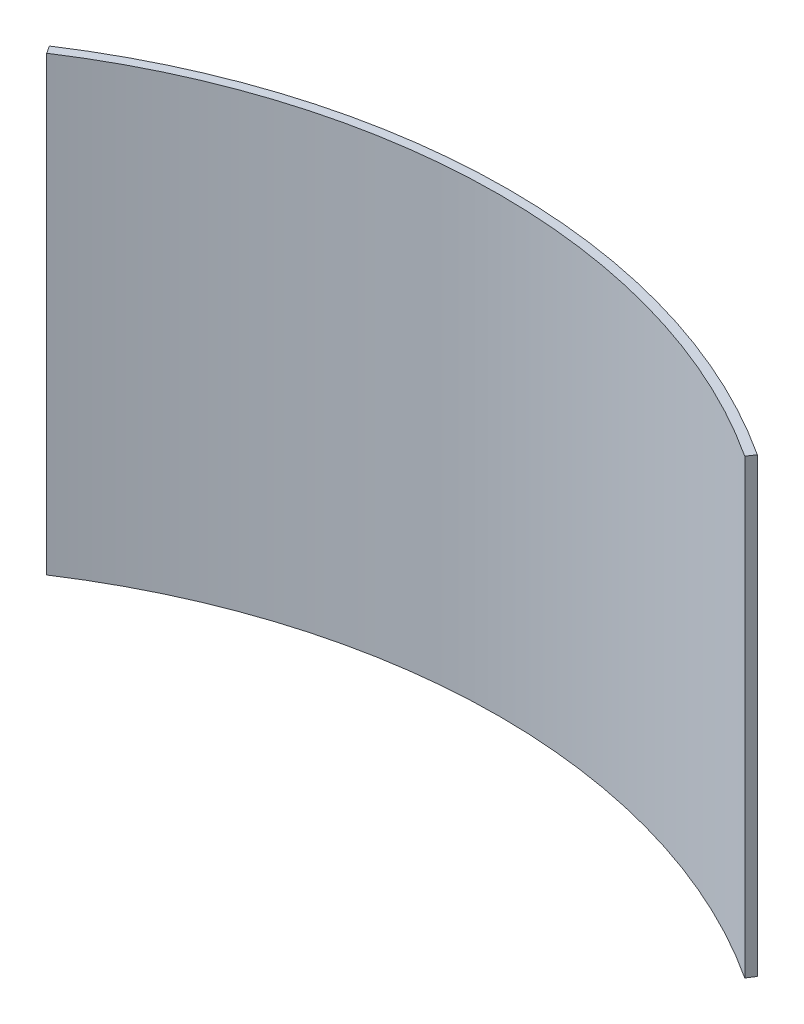
ISO-10303-21;
HEADER;
FILE_DESCRIPTION(('STEP AP214'),'2;1');
FILE_NAME('part.step','',(''),(''),'','','');
FILE_SCHEMA(('AUTOMOTIVE_DESIGN { 1 0 10303 214 1 1 1 1 }'));
ENDSEC;
DATA;
#1=APPLICATION_CONTEXT('core data for automotive mechanical design processes');
#2=APPLICATION_PROTOCOL_DEFINITION('international standard','automotive_design',2000,#1);
#3=PRODUCT_CONTEXT('',#1,'mechanical');
#4=PRODUCT('Part','Part','',(#3));
#5=PRODUCT_RELATED_PRODUCT_CATEGORY('part','',(#4));
#6=PRODUCT_DEFINITION_FORMATION('','',#4);
#7=PRODUCT_DEFINITION_CONTEXT('part definition',#1,'design');
#8=PRODUCT_DEFINITION('design','',#6,#7);
#9=PRODUCT_DEFINITION_SHAPE('','',#8);
#10=(LENGTH_UNIT() NAMED_UNIT(*) SI_UNIT(.MILLI.,.METRE.));
#11=(NAMED_UNIT(*) PLANE_ANGLE_UNIT() SI_UNIT($,.RADIAN.));
#12=(NAMED_UNIT(*) SI_UNIT($,.STERADIAN.) SOLID_ANGLE_UNIT());
#13=UNCERTAINTY_MEASURE_WITH_UNIT(LENGTH_MEASURE(1.E-05),#10,'distance_accuracy_value','');
#14=(GEOMETRIC_REPRESENTATION_CONTEXT(3) GLOBAL_UNCERTAINTY_ASSIGNED_CONTEXT((#13)) GLOBAL_UNIT_ASSIGNED_CONTEXT((#10,
#11,#12)) REPRESENTATION_CONTEXT('',''));
#15=CARTESIAN_POINT('',(0.,0.,0.));
#16=DIRECTION('',(0.,0.,1.));
#17=DIRECTION('',(1.,0.,0.));
#18=AXIS2_PLACEMENT_3D('',#15,#16,#17);
#19=CARTESIAN_POINT('',(132.141800549526,150.,122.232142857143));
#20=DIRECTION('',(0.,-1.,0.));
#21=DIRECTION('',(0.,0.,-1.));
#22=AXIS2_PLACEMENT_3D('',#19,#20,#21);
#23=CYLINDRICAL_SURFACE('',#22,211.732142857143);
#24=CARTESIAN_POINT('',(132.141800549526,0.,122.232142857143));
#25=DIRECTION('',(0.,1.,0.));
#26=DIRECTION('',(1.,0.,0.));
#27=AXIS2_PLACEMENT_3D('',#24,#25,#26);
#28=CIRCLE('',#27,211.732142857143);
#29=CARTESIAN_POINT('',(16.2833805911064,0.,-54.9889812889813));
#30=VERTEX_POINT('',#29);
#31=CARTESIAN_POINT('',(248.000220507946,0.,-54.9889812889813));
#32=VERTEX_POINT('',#31);
#33=EDGE_CURVE('E93',#30,#32,#28,.F.);
#34=ORIENTED_EDGE('',*,*,#33,.T.);
#35=DIRECTION('',(0.,-1.,0.));
#36=VECTOR('',#35,1.);
#37=CARTESIAN_POINT('',(248.000220507946,150.,-54.9889812889813));
#38=LINE('',#37,#36);
#39=CARTESIAN_POINT('',(248.000220507946,150.,-54.9889812889813));
#40=VERTEX_POINT('',#39);
#41=EDGE_CURVE('E11',#40,#32,#38,.T.);
#42=ORIENTED_EDGE('',*,*,#41,.F.);
#43=CARTESIAN_POINT('',(132.141800549526,150.,122.232142857143));
#44=DIRECTION('',(0.,1.,0.));
#45=DIRECTION('',(1.,0.,0.));
#46=AXIS2_PLACEMENT_3D('',#43,#44,#45);
#47=CIRCLE('',#46,211.732142857143);
#48=CARTESIAN_POINT('',(16.2833805911064,150.,-54.9889812889813));
#49=VERTEX_POINT('',#48);
#50=EDGE_CURVE('E70',#49,#40,#47,.F.);
#51=ORIENTED_EDGE('',*,*,#50,.F.);
#52=DIRECTION('',(0.,-1.,0.));
#53=VECTOR('',#52,1.);
#54=CARTESIAN_POINT('',(16.2833805911064,150.,-54.9889812889813));
#55=LINE('',#54,#53);
#56=EDGE_CURVE('E46',#49,#30,#55,.T.);
#57=ORIENTED_EDGE('',*,*,#56,.T.);
#58=EDGE_LOOP('',(#34,#42,#51,#57));
#59=FACE_BOUND('',#58,.T.);
#60=ADVANCED_FACE('F30',(#59),#23,.F.);
#61=CARTESIAN_POINT('',(249.641800549526,150.,-57.5));
#62=DIRECTION('',(0.837006237006234,0.,0.547193347193352));
#63=DIRECTION('',(0.547193347193352,0.,-0.837006237006234));
#64=AXIS2_PLACEMENT_3D('',#61,#62,#63);
#65=PLANE('',#64);
#66=DIRECTION('',(-0.547193347193352,0.,0.837006237006234));
#67=VECTOR('',#66,1.);
#68=CARTESIAN_POINT('',(249.641800549526,0.,-57.5));
#69=LINE('',#68,#67);
#70=CARTESIAN_POINT('',(249.641800549526,0.,-57.5));
#71=VERTEX_POINT('',#70);
#72=EDGE_CURVE('E79',#71,#32,#69,.T.);
#73=ORIENTED_EDGE('',*,*,#72,.F.);
#74=DIRECTION('',(0.,-1.,0.));
#75=VECTOR('',#74,1.);
#76=CARTESIAN_POINT('',(249.641800549526,150.,-57.5));
#77=LINE('',#76,#75);
#78=CARTESIAN_POINT('',(249.641800549526,150.,-57.5));
#79=VERTEX_POINT('',#78);
#80=EDGE_CURVE('E38',#79,#71,#77,.T.);
#81=ORIENTED_EDGE('',*,*,#80,.F.);
#82=DIRECTION('',(-0.547193347193352,0.,0.837006237006234));
#83=VECTOR('',#82,1.);
#84=CARTESIAN_POINT('',(249.641800549526,150.,-57.5));
#85=LINE('',#84,#83);
#86=EDGE_CURVE('E77',#79,#40,#85,.T.);
#87=ORIENTED_EDGE('',*,*,#86,.T.);
#88=ORIENTED_EDGE('',*,*,#41,.T.);
#89=EDGE_LOOP('',(#73,#81,#87,#88));
#90=FACE_BOUND('',#89,.T.);
#91=ADVANCED_FACE('F76',(#90),#65,.T.);
#92=CARTESIAN_POINT('',(132.141800549526,150.,122.232142857143));
#93=DIRECTION('',(0.,-1.,0.));
#94=DIRECTION('',(0.,0.,-1.));
#95=AXIS2_PLACEMENT_3D('',#92,#93,#94);
#96=CYLINDRICAL_SURFACE('',#95,214.732142857143);
#97=CARTESIAN_POINT('',(132.141800549526,0.,122.232142857143));
#98=DIRECTION('',(0.,-1.,0.));
#99=DIRECTION('',(0.,0.,-1.));
#100=AXIS2_PLACEMENT_3D('',#97,#98,#99);
#101=CIRCLE('',#100,214.732142857143);
#102=CARTESIAN_POINT('',(14.6418005495264,0.,-57.5));
#103=VERTEX_POINT('',#102);
#104=EDGE_CURVE('E96',#103,#71,#101,.T.);
#105=ORIENTED_EDGE('',*,*,#104,.F.);
#106=DIRECTION('',(0.,-1.,0.));
#107=VECTOR('',#106,1.);
#108=CARTESIAN_POINT('',(14.6418005495264,150.,-57.5));
#109=LINE('',#108,#107);
#110=CARTESIAN_POINT('',(14.6418005495264,150.,-57.5));
#111=VERTEX_POINT('',#110);
#112=EDGE_CURVE('E59',#111,#103,#109,.T.);
#113=ORIENTED_EDGE('',*,*,#112,.F.);
#114=CARTESIAN_POINT('',(132.141800549526,150.,122.232142857143));
#115=DIRECTION('',(0.,-1.,0.));
#116=DIRECTION('',(0.,0.,-1.));
#117=AXIS2_PLACEMENT_3D('',#114,#115,#116);
#118=CIRCLE('',#117,214.732142857143);
#119=EDGE_CURVE('E85',#111,#79,#118,.T.);
#120=ORIENTED_EDGE('',*,*,#119,.T.);
#121=ORIENTED_EDGE('',*,*,#80,.T.);
#122=EDGE_LOOP('',(#105,#113,#120,#121));
#123=FACE_BOUND('',#122,.T.);
#124=ADVANCED_FACE('F87',(#123),#96,.T.);
#125=CARTESIAN_POINT('',(16.2833805911064,150.,-54.9889812889813));
#126=DIRECTION('',(-0.837006237006243,0.,0.547193347193338));
#127=DIRECTION('',(0.547193347193338,0.,0.837006237006243));
#128=AXIS2_PLACEMENT_3D('',#125,#126,#127);
#129=PLANE('',#128);
#130=DIRECTION('',(-0.547193347193338,0.,-0.837006237006243));
#131=VECTOR('',#130,1.);
#132=CARTESIAN_POINT('',(16.2833805911064,0.,-54.9889812889813));
#133=LINE('',#132,#131);
#134=EDGE_CURVE('E98',#30,#103,#133,.T.);
#135=ORIENTED_EDGE('',*,*,#134,.F.);
#136=ORIENTED_EDGE('',*,*,#56,.F.);
#137=DIRECTION('',(-0.547193347193338,0.,-0.837006237006243));
#138=VECTOR('',#137,1.);
#139=CARTESIAN_POINT('',(16.2833805911064,150.,-54.9889812889813));
#140=LINE('',#139,#138);
#141=EDGE_CURVE('E88',#49,#111,#140,.T.);
#142=ORIENTED_EDGE('',*,*,#141,.T.);
#143=ORIENTED_EDGE('',*,*,#112,.T.);
#144=EDGE_LOOP('',(#135,#136,#142,#143));
#145=FACE_BOUND('',#144,.T.);
#146=ADVANCED_FACE('F104',(#145),#129,.T.);
#147=CARTESIAN_POINT('',(132.141800549526,150.,122.232142857143));
#148=DIRECTION('',(0.,1.,0.));
#149=DIRECTION('',(0.,0.,1.));
#150=AXIS2_PLACEMENT_3D('',#147,#148,#149);
#151=PLANE('',#150);
#152=ORIENTED_EDGE('',*,*,#50,.T.);
#153=ORIENTED_EDGE('',*,*,#86,.F.);
#154=ORIENTED_EDGE('',*,*,#119,.F.);
#155=ORIENTED_EDGE('',*,*,#141,.F.);
#156=EDGE_LOOP('',(#152,#153,#154,#155));
#157=FACE_BOUND('',#156,.T.);
#158=ADVANCED_FACE('F84',(#157),#151,.T.);
#159=CARTESIAN_POINT('',(132.141800549526,0.,122.232142857143));
#160=DIRECTION('',(0.,1.,0.));
#161=DIRECTION('',(0.,0.,1.));
#162=AXIS2_PLACEMENT_3D('',#159,#160,#161);
#163=PLANE('',#162);
#164=ORIENTED_EDGE('',*,*,#33,.F.);
#165=ORIENTED_EDGE('',*,*,#134,.T.);
#166=ORIENTED_EDGE('',*,*,#104,.T.);
#167=ORIENTED_EDGE('',*,*,#72,.T.);
#168=EDGE_LOOP('',(#164,#165,#166,#167));
#169=FACE_BOUND('',#168,.T.);
#170=ADVANCED_FACE('F103',(#169),#163,.F.);
#171=CLOSED_SHELL('',(#60,#91,#124,#146,#158,#170));
#172=MANIFOLD_SOLID_BREP('B2',#171);
#173=ADVANCED_BREP_SHAPE_REPRESENTATION('',(#18,#172),#14);
#174=SHAPE_DEFINITION_REPRESENTATION(#9,#173);
ENDSEC;
END-ISO-10303-21;
